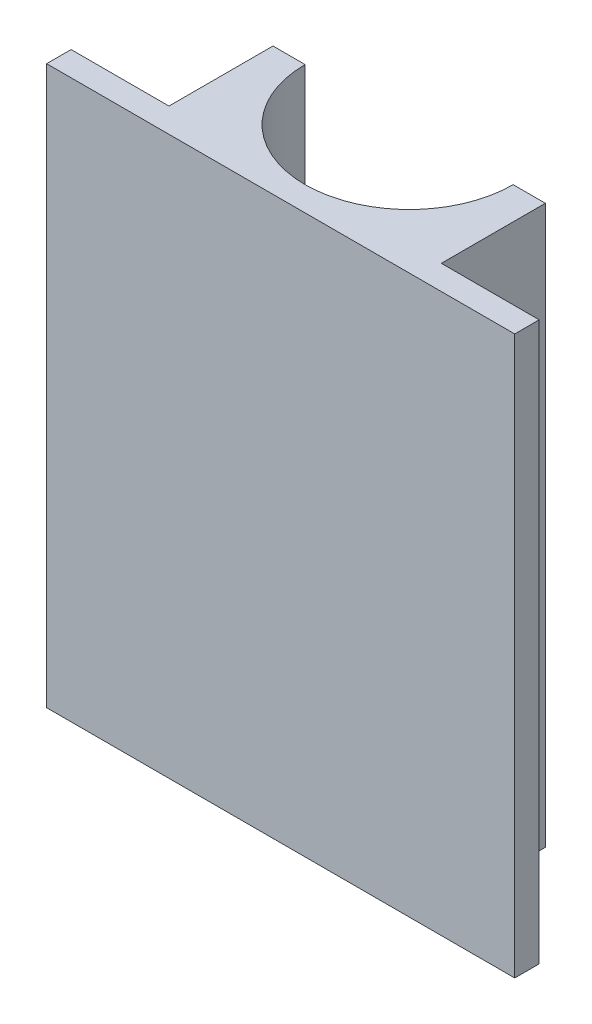
ISO-10303-21;
HEADER;
FILE_DESCRIPTION(('STEP AP214'),'2;1');
FILE_NAME('part.step','',(''),(''),'','','');
FILE_SCHEMA(('AUTOMOTIVE_DESIGN { 1 0 10303 214 1 1 1 1 }'));
ENDSEC;
DATA;
#1=APPLICATION_CONTEXT('core data for automotive mechanical design processes');
#2=APPLICATION_PROTOCOL_DEFINITION('international standard','automotive_design',2000,#1);
#3=PRODUCT_CONTEXT('',#1,'mechanical');
#4=PRODUCT('Part','Part','',(#3));
#5=PRODUCT_RELATED_PRODUCT_CATEGORY('part','',(#4));
#6=PRODUCT_DEFINITION_FORMATION('','',#4);
#7=PRODUCT_DEFINITION_CONTEXT('part definition',#1,'design');
#8=PRODUCT_DEFINITION('design','',#6,#7);
#9=PRODUCT_DEFINITION_SHAPE('','',#8);
#10=(LENGTH_UNIT() NAMED_UNIT(*) SI_UNIT(.MILLI.,.METRE.));
#11=(NAMED_UNIT(*) PLANE_ANGLE_UNIT() SI_UNIT($,.RADIAN.));
#12=(NAMED_UNIT(*) SI_UNIT($,.STERADIAN.) SOLID_ANGLE_UNIT());
#13=UNCERTAINTY_MEASURE_WITH_UNIT(LENGTH_MEASURE(1.E-05),#10,'distance_accuracy_value','');
#14=(GEOMETRIC_REPRESENTATION_CONTEXT(3) GLOBAL_UNCERTAINTY_ASSIGNED_CONTEXT((#13)) GLOBAL_UNIT_ASSIGNED_CONTEXT((#10,
#11,#12)) REPRESENTATION_CONTEXT('',''));
#15=CARTESIAN_POINT('',(0.,0.,0.));
#16=DIRECTION('',(0.,0.,1.));
#17=DIRECTION('',(1.,0.,0.));
#18=AXIS2_PLACEMENT_3D('',#15,#16,#17);
#19=CARTESIAN_POINT('',(6.525,72.39,-31.19817027));
#20=DIRECTION('',(0.,-1.,0.));
#21=DIRECTION('',(0.,0.,-1.));
#22=AXIS2_PLACEMENT_3D('',#19,#20,#21);
#23=CYLINDRICAL_SURFACE('',#22,13.5);
#24=CARTESIAN_POINT('',(6.525,51.39,-31.19817027));
#25=DIRECTION('',(0.,1.,0.));
#26=DIRECTION('',(0.,0.,1.));
#27=AXIS2_PLACEMENT_3D('',#24,#25,#26);
#28=CIRCLE('',#27,13.5);
#29=CARTESIAN_POINT('',(-6.975,51.39,-31.1981702709716));
#30=VERTEX_POINT('',#29);
#31=CARTESIAN_POINT('',(20.025,51.39,-31.1981702709716));
#32=VERTEX_POINT('',#31);
#33=EDGE_CURVE('E275',#30,#32,#28,.T.);
#34=ORIENTED_EDGE('',*,*,#33,.F.);
#35=DIRECTION('',(0.,-1.,0.));
#36=VECTOR('',#35,1.);
#37=CARTESIAN_POINT('',(-6.975,72.39,-31.1981702709716));
#38=LINE('',#37,#36);
#39=CARTESIAN_POINT('',(-6.975,72.39,-31.1981702709716));
#40=VERTEX_POINT('',#39);
#41=EDGE_CURVE('E11',#40,#30,#38,.T.);
#42=ORIENTED_EDGE('',*,*,#41,.F.);
#43=CARTESIAN_POINT('',(6.525,72.39,-31.19817027));
#44=DIRECTION('',(0.,1.,0.));
#45=DIRECTION('',(0.,0.,1.));
#46=AXIS2_PLACEMENT_3D('',#43,#44,#45);
#47=CIRCLE('',#46,13.5);
#48=CARTESIAN_POINT('',(20.025,72.39,-31.1981702709716));
#49=VERTEX_POINT('',#48);
#50=EDGE_CURVE('E172',#40,#49,#47,.T.);
#51=ORIENTED_EDGE('',*,*,#50,.T.);
#52=DIRECTION('',(0.,-1.,0.));
#53=VECTOR('',#52,1.);
#54=CARTESIAN_POINT('',(20.025,72.39,-31.1981702709716));
#55=LINE('',#54,#53);
#56=EDGE_CURVE('E137',#49,#32,#55,.T.);
#57=ORIENTED_EDGE('',*,*,#56,.T.);
#58=EDGE_LOOP('',(#34,#42,#51,#57));
#59=FACE_BOUND('',#58,.T.);
#60=ADVANCED_FACE('F32',(#59),#23,.F.);
#61=CARTESIAN_POINT('',(0.,72.39,-31.1981702709716));
#62=DIRECTION('',(0.,0.,1.));
#63=DIRECTION('',(1.,0.,0.));
#64=AXIS2_PLACEMENT_3D('',#61,#62,#63);
#65=PLANE('',#64);
#66=DIRECTION('',(-1.,0.,0.));
#67=VECTOR('',#66,1.);
#68=CARTESIAN_POINT('',(0.,0.,-31.1981702709716));
#69=LINE('',#68,#67);
#70=CARTESIAN_POINT('',(-6.675,0.,-31.1981702709716));
#71=VERTEX_POINT('',#70);
#72=CARTESIAN_POINT('',(-11.1466884,0.,-31.1981702709716));
#73=VERTEX_POINT('',#72);
#74=EDGE_CURVE('E144',#71,#73,#69,.T.);
#75=ORIENTED_EDGE('',*,*,#74,.T.);
#76=DIRECTION('',(0.,-1.,0.));
#77=VECTOR('',#76,1.);
#78=CARTESIAN_POINT('',(-11.1466884,72.39,-31.1981702709716));
#79=LINE('',#78,#77);
#80=CARTESIAN_POINT('',(-11.1466884,72.39,-31.1981702709716));
#81=VERTEX_POINT('',#80);
#82=EDGE_CURVE('E43',#81,#73,#79,.T.);
#83=ORIENTED_EDGE('',*,*,#82,.F.);
#84=DIRECTION('',(-1.,0.,0.));
#85=VECTOR('',#84,1.);
#86=CARTESIAN_POINT('',(0.,72.39,-31.1981702709716));
#87=LINE('',#86,#85);
#88=EDGE_CURVE('E254',#40,#81,#87,.T.);
#89=ORIENTED_EDGE('',*,*,#88,.F.);
#90=ORIENTED_EDGE('',*,*,#41,.T.);
#91=DIRECTION('',(1.,0.,0.));
#92=VECTOR('',#91,1.);
#93=CARTESIAN_POINT('',(-6.975,51.39,-31.1981702709716));
#94=LINE('',#93,#92);
#95=CARTESIAN_POINT('',(-6.675,51.39,-31.1981702709716));
#96=VERTEX_POINT('',#95);
#97=EDGE_CURVE('E283',#30,#96,#94,.T.);
#98=ORIENTED_EDGE('',*,*,#97,.T.);
#99=DIRECTION('',(0.,-1.,0.));
#100=VECTOR('',#99,1.);
#101=CARTESIAN_POINT('',(-6.675,51.39,-31.1981702709716));
#102=LINE('',#101,#100);
#103=EDGE_CURVE('E235',#96,#71,#102,.T.);
#104=ORIENTED_EDGE('',*,*,#103,.T.);
#105=EDGE_LOOP('',(#75,#83,#89,#90,#98,#104));
#106=FACE_BOUND('',#105,.T.);
#107=ADVANCED_FACE('F221',(#106),#65,.F.);
#108=CARTESIAN_POINT('',(-11.1466884,72.39,0.));
#109=DIRECTION('',(1.,0.,0.));
#110=DIRECTION('',(0.,0.,-1.));
#111=AXIS2_PLACEMENT_3D('',#108,#109,#110);
#112=PLANE('',#111);
#113=DIRECTION('',(0.,0.,1.));
#114=VECTOR('',#113,1.);
#115=CARTESIAN_POINT('',(-11.1466884,0.,0.));
#116=LINE('',#115,#114);
#117=CARTESIAN_POINT('',(-11.1466884,0.,-17.6981702709716));
#118=VERTEX_POINT('',#117);
#119=EDGE_CURVE('E146',#73,#118,#116,.T.);
#120=ORIENTED_EDGE('',*,*,#119,.T.);
#121=DIRECTION('',(0.,-1.,0.));
#122=VECTOR('',#121,1.);
#123=CARTESIAN_POINT('',(-11.1466884,72.39,-17.6981702709716));
#124=LINE('',#123,#122);
#125=CARTESIAN_POINT('',(-11.1466884,72.39,-17.6981702709716));
#126=VERTEX_POINT('',#125);
#127=EDGE_CURVE('E184',#126,#118,#124,.T.);
#128=ORIENTED_EDGE('',*,*,#127,.F.);
#129=DIRECTION('',(0.,0.,1.));
#130=VECTOR('',#129,1.);
#131=CARTESIAN_POINT('',(-11.1466884,72.39,0.));
#132=LINE('',#131,#130);
#133=EDGE_CURVE('E241',#81,#126,#132,.T.);
#134=ORIENTED_EDGE('',*,*,#133,.F.);
#135=ORIENTED_EDGE('',*,*,#82,.T.);
#136=EDGE_LOOP('',(#120,#128,#134,#135));
#137=FACE_BOUND('',#136,.T.);
#138=ADVANCED_FACE('F218',(#137),#112,.F.);
#139=CARTESIAN_POINT('',(0.,72.39,-17.6981702709716));
#140=DIRECTION('',(0.,0.,-1.));
#141=DIRECTION('',(-1.,0.,0.));
#142=AXIS2_PLACEMENT_3D('',#139,#140,#141);
#143=PLANE('',#142);
#144=DIRECTION('',(1.,0.,0.));
#145=VECTOR('',#144,1.);
#146=CARTESIAN_POINT('',(0.,0.,-17.6981702709716));
#147=LINE('',#146,#145);
#148=CARTESIAN_POINT('',(-23.8485284,0.,-17.6981702709716));
#149=VERTEX_POINT('',#148);
#150=EDGE_CURVE('E150',#149,#118,#147,.T.);
#151=ORIENTED_EDGE('',*,*,#150,.F.);
#152=DIRECTION('',(0.,-1.,0.));
#153=VECTOR('',#152,1.);
#154=CARTESIAN_POINT('',(-23.8485284,72.39,-17.6981702709716));
#155=LINE('',#154,#153);
#156=CARTESIAN_POINT('',(-23.8485284,72.39,-17.6981702709716));
#157=VERTEX_POINT('',#156);
#158=EDGE_CURVE('E182',#157,#149,#155,.T.);
#159=ORIENTED_EDGE('',*,*,#158,.F.);
#160=DIRECTION('',(1.,0.,0.));
#161=VECTOR('',#160,1.);
#162=CARTESIAN_POINT('',(0.,72.39,-17.6981702709716));
#163=LINE('',#162,#161);
#164=EDGE_CURVE('E249',#157,#126,#163,.T.);
#165=ORIENTED_EDGE('',*,*,#164,.T.);
#166=ORIENTED_EDGE('',*,*,#127,.T.);
#167=EDGE_LOOP('',(#151,#159,#165,#166));
#168=FACE_BOUND('',#167,.T.);
#169=ADVANCED_FACE('F214',(#168),#143,.T.);
#170=CARTESIAN_POINT('',(-23.8485284,72.39,0.));
#171=DIRECTION('',(1.,0.,0.));
#172=DIRECTION('',(0.,0.,-1.));
#173=AXIS2_PLACEMENT_3D('',#170,#171,#172);
#174=PLANE('',#173);
#175=DIRECTION('',(0.,0.,1.));
#176=VECTOR('',#175,1.);
#177=CARTESIAN_POINT('',(-23.8485284,0.,0.));
#178=LINE('',#177,#176);
#179=CARTESIAN_POINT('',(-23.8485284,0.,-14.5231702709716));
#180=VERTEX_POINT('',#179);
#181=EDGE_CURVE('E153',#149,#180,#178,.T.);
#182=ORIENTED_EDGE('',*,*,#181,.T.);
#183=DIRECTION('',(0.,-1.,0.));
#184=VECTOR('',#183,1.);
#185=CARTESIAN_POINT('',(-23.8485284,72.39,-14.5231702709716));
#186=LINE('',#185,#184);
#187=CARTESIAN_POINT('',(-23.8485284,72.39,-14.5231702709716));
#188=VERTEX_POINT('',#187);
#189=EDGE_CURVE('E179',#188,#180,#186,.T.);
#190=ORIENTED_EDGE('',*,*,#189,.F.);
#191=DIRECTION('',(0.,0.,1.));
#192=VECTOR('',#191,1.);
#193=CARTESIAN_POINT('',(-23.8485284,72.39,0.));
#194=LINE('',#193,#192);
#195=EDGE_CURVE('E250',#157,#188,#194,.T.);
#196=ORIENTED_EDGE('',*,*,#195,.F.);
#197=ORIENTED_EDGE('',*,*,#158,.T.);
#198=EDGE_LOOP('',(#182,#190,#196,#197));
#199=FACE_BOUND('',#198,.T.);
#200=ADVANCED_FACE('F210',(#199),#174,.F.);
#201=CARTESIAN_POINT('',(0.,72.39,-14.5231702709716));
#202=DIRECTION('',(0.,0.,-1.));
#203=DIRECTION('',(-1.,0.,0.));
#204=AXIS2_PLACEMENT_3D('',#201,#202,#203);
#205=PLANE('',#204);
#206=DIRECTION('',(1.,0.,0.));
#207=VECTOR('',#206,1.);
#208=CARTESIAN_POINT('',(0.,0.,-14.5231702709716));
#209=LINE('',#208,#207);
#210=CARTESIAN_POINT('',(36.9033116,0.,-14.5231702709716));
#211=VERTEX_POINT('',#210);
#212=EDGE_CURVE('E155',#180,#211,#209,.T.);
#213=ORIENTED_EDGE('',*,*,#212,.T.);
#214=DIRECTION('',(0.,-1.,0.));
#215=VECTOR('',#214,1.);
#216=CARTESIAN_POINT('',(36.9033116,72.39,-14.5231702709716));
#217=LINE('',#216,#215);
#218=CARTESIAN_POINT('',(36.9033116,72.39,-14.5231702709716));
#219=VERTEX_POINT('',#218);
#220=EDGE_CURVE('E177',#219,#211,#217,.T.);
#221=ORIENTED_EDGE('',*,*,#220,.F.);
#222=DIRECTION('',(1.,0.,0.));
#223=VECTOR('',#222,1.);
#224=CARTESIAN_POINT('',(0.,72.39,-14.5231702709716));
#225=LINE('',#224,#223);
#226=EDGE_CURVE('E252',#188,#219,#225,.T.);
#227=ORIENTED_EDGE('',*,*,#226,.F.);
#228=ORIENTED_EDGE('',*,*,#189,.T.);
#229=EDGE_LOOP('',(#213,#221,#227,#228));
#230=FACE_BOUND('',#229,.T.);
#231=ADVANCED_FACE('F206',(#230),#205,.F.);
#232=CARTESIAN_POINT('',(36.9033116,72.39,0.));
#233=DIRECTION('',(1.,0.,0.));
#234=DIRECTION('',(0.,0.,-1.));
#235=AXIS2_PLACEMENT_3D('',#232,#233,#234);
#236=PLANE('',#235);
#237=DIRECTION('',(0.,0.,1.));
#238=VECTOR('',#237,1.);
#239=CARTESIAN_POINT('',(36.9033116,0.,0.));
#240=LINE('',#239,#238);
#241=CARTESIAN_POINT('',(36.9033116,0.,-17.6981702709716));
#242=VERTEX_POINT('',#241);
#243=EDGE_CURVE('E158',#242,#211,#240,.T.);
#244=ORIENTED_EDGE('',*,*,#243,.F.);
#245=DIRECTION('',(0.,-1.,0.));
#246=VECTOR('',#245,1.);
#247=CARTESIAN_POINT('',(36.9033116,72.39,-17.6981702709716));
#248=LINE('',#247,#246);
#249=CARTESIAN_POINT('',(36.9033116,72.39,-17.6981702709716));
#250=VERTEX_POINT('',#249);
#251=EDGE_CURVE('E127',#250,#242,#248,.T.);
#252=ORIENTED_EDGE('',*,*,#251,.F.);
#253=DIRECTION('',(0.,0.,1.));
#254=VECTOR('',#253,1.);
#255=CARTESIAN_POINT('',(36.9033116,72.39,0.));
#256=LINE('',#255,#254);
#257=EDGE_CURVE('E133',#250,#219,#256,.T.);
#258=ORIENTED_EDGE('',*,*,#257,.T.);
#259=ORIENTED_EDGE('',*,*,#220,.T.);
#260=EDGE_LOOP('',(#244,#252,#258,#259));
#261=FACE_BOUND('',#260,.T.);
#262=ADVANCED_FACE('F203',(#261),#236,.T.);
#263=CARTESIAN_POINT('',(0.,72.39,-17.6981702709716));
#264=DIRECTION('',(0.,0.,-1.));
#265=DIRECTION('',(-1.,0.,0.));
#266=AXIS2_PLACEMENT_3D('',#263,#264,#265);
#267=PLANE('',#266);
#268=DIRECTION('',(1.,0.,0.));
#269=VECTOR('',#268,1.);
#270=CARTESIAN_POINT('',(0.,0.,-17.6981702709716));
#271=LINE('',#270,#269);
#272=CARTESIAN_POINT('',(24.2033116,0.,-17.6981702709716));
#273=VERTEX_POINT('',#272);
#274=EDGE_CURVE('E125',#273,#242,#271,.T.);
#275=ORIENTED_EDGE('',*,*,#274,.F.);
#276=CARTESIAN_POINT('',(24.2033116,72.39,-17.6981702709716));
#277=DIRECTION('',(0.,-1.,0.));
#278=VECTOR('',#277,1.);
#279=LINE('',#276,#278);
#280=CARTESIAN_POINT('',(24.2033116,72.39,-17.6981702709716));
#281=VERTEX_POINT('',#280);
#282=EDGE_CURVE('E83',#281,#273,#279,.T.);
#283=ORIENTED_EDGE('',*,*,#282,.F.);
#284=DIRECTION('',(1.,0.,0.));
#285=VECTOR('',#284,1.);
#286=CARTESIAN_POINT('',(0.,72.39,-17.6981702709716));
#287=LINE('',#286,#285);
#288=EDGE_CURVE('E123',#281,#250,#287,.T.);
#289=ORIENTED_EDGE('',*,*,#288,.T.);
#290=ORIENTED_EDGE('',*,*,#251,.T.);
#291=EDGE_LOOP('',(#275,#283,#289,#290));
#292=FACE_BOUND('',#291,.T.);
#293=ADVANCED_FACE('F122',(#292),#267,.T.);
#294=CARTESIAN_POINT('',(24.2033116,72.39,0.));
#295=DIRECTION('',(1.,0.,0.));
#296=DIRECTION('',(0.,0.,-1.));
#297=AXIS2_PLACEMENT_3D('',#294,#295,#296);
#298=PLANE('',#297);
#299=DIRECTION('',(0.,0.,1.));
#300=VECTOR('',#299,1.);
#301=CARTESIAN_POINT('',(24.2033116,0.,0.));
#302=LINE('',#301,#300);
#303=CARTESIAN_POINT('',(24.2033116,0.,-31.1981702709716));
#304=VERTEX_POINT('',#303);
#305=EDGE_CURVE('E164',#304,#273,#302,.T.);
#306=ORIENTED_EDGE('',*,*,#305,.F.);
#307=DIRECTION('',(0.,-1.,0.));
#308=VECTOR('',#307,1.);
#309=CARTESIAN_POINT('',(24.2033116,72.39,-31.1981702709716));
#310=LINE('',#309,#308);
#311=CARTESIAN_POINT('',(24.2033116,72.39,-31.1981702709716));
#312=VERTEX_POINT('',#311);
#313=EDGE_CURVE('E90',#312,#304,#310,.T.);
#314=ORIENTED_EDGE('',*,*,#313,.F.);
#315=DIRECTION('',(0.,0.,1.));
#316=VECTOR('',#315,1.);
#317=CARTESIAN_POINT('',(24.2033116,72.39,0.));
#318=LINE('',#317,#316);
#319=EDGE_CURVE('E131',#312,#281,#318,.T.);
#320=ORIENTED_EDGE('',*,*,#319,.T.);
#321=ORIENTED_EDGE('',*,*,#282,.T.);
#322=EDGE_LOOP('',(#306,#314,#320,#321));
#323=FACE_BOUND('',#322,.T.);
#324=ADVANCED_FACE('F135',(#323),#298,.T.);
#325=CARTESIAN_POINT('',(0.,72.39,-31.1981702709716));
#326=DIRECTION('',(0.,0.,1.));
#327=DIRECTION('',(1.,0.,0.));
#328=AXIS2_PLACEMENT_3D('',#325,#326,#327);
#329=PLANE('',#328);
#330=DIRECTION('',(-1.,0.,0.));
#331=VECTOR('',#330,1.);
#332=CARTESIAN_POINT('',(0.,0.,-31.1981702709716));
#333=LINE('',#332,#331);
#334=CARTESIAN_POINT('',(19.725,0.,-31.1981702709716));
#335=VERTEX_POINT('',#334);
#336=EDGE_CURVE('E168',#304,#335,#333,.T.);
#337=ORIENTED_EDGE('',*,*,#336,.T.);
#338=DIRECTION('',(0.,-1.,0.));
#339=VECTOR('',#338,1.);
#340=CARTESIAN_POINT('',(19.725,51.39,-31.1981702709716));
#341=LINE('',#340,#339);
#342=CARTESIAN_POINT('',(19.725,51.39,-31.1981702709716));
#343=VERTEX_POINT('',#342);
#344=EDGE_CURVE('E147',#343,#335,#341,.T.);
#345=ORIENTED_EDGE('',*,*,#344,.F.);
#346=DIRECTION('',(-1.,0.,0.));
#347=VECTOR('',#346,1.);
#348=CARTESIAN_POINT('',(20.025,51.39,-31.1981702709716));
#349=LINE('',#348,#347);
#350=EDGE_CURVE('E293',#32,#343,#349,.T.);
#351=ORIENTED_EDGE('',*,*,#350,.F.);
#352=ORIENTED_EDGE('',*,*,#56,.F.);
#353=DIRECTION('',(-1.,0.,0.));
#354=VECTOR('',#353,1.);
#355=CARTESIAN_POINT('',(0.,72.39,-31.1981702709716));
#356=LINE('',#355,#354);
#357=EDGE_CURVE('E52',#312,#49,#356,.T.);
#358=ORIENTED_EDGE('',*,*,#357,.F.);
#359=ORIENTED_EDGE('',*,*,#313,.T.);
#360=EDGE_LOOP('',(#337,#345,#351,#352,#358,#359));
#361=FACE_BOUND('',#360,.T.);
#362=ADVANCED_FACE('F198',(#361),#329,.F.);
#363=CARTESIAN_POINT('',(0.,72.39,0.));
#364=DIRECTION('',(0.,1.,0.));
#365=DIRECTION('',(0.,0.,1.));
#366=AXIS2_PLACEMENT_3D('',#363,#364,#365);
#367=PLANE('',#366);
#368=ORIENTED_EDGE('',*,*,#50,.F.);
#369=ORIENTED_EDGE('',*,*,#88,.T.);
#370=ORIENTED_EDGE('',*,*,#133,.T.);
#371=ORIENTED_EDGE('',*,*,#164,.F.);
#372=ORIENTED_EDGE('',*,*,#195,.T.);
#373=ORIENTED_EDGE('',*,*,#226,.T.);
#374=ORIENTED_EDGE('',*,*,#257,.F.);
#375=ORIENTED_EDGE('',*,*,#288,.F.);
#376=ORIENTED_EDGE('',*,*,#319,.F.);
#377=ORIENTED_EDGE('',*,*,#357,.T.);
#378=EDGE_LOOP('',(#368,#369,#370,#371,#372,#373,#374,#375,#376,#377));
#379=FACE_BOUND('',#378,.T.);
#380=ADVANCED_FACE('F130',(#379),#367,.T.);
#381=CARTESIAN_POINT('',(0.,0.,0.));
#382=DIRECTION('',(0.,1.,0.));
#383=DIRECTION('',(0.,0.,1.));
#384=AXIS2_PLACEMENT_3D('',#381,#382,#383);
#385=PLANE('',#384);
#386=ORIENTED_EDGE('',*,*,#74,.F.);
#387=CARTESIAN_POINT('',(6.525,0.,-31.19817027));
#388=DIRECTION('',(0.,1.,0.));
#389=DIRECTION('',(0.,0.,1.));
#390=AXIS2_PLACEMENT_3D('',#387,#388,#389);
#391=CIRCLE('',#390,13.2);
#392=EDGE_CURVE('E263',#71,#335,#391,.T.);
#393=ORIENTED_EDGE('',*,*,#392,.T.);
#394=ORIENTED_EDGE('',*,*,#336,.F.);
#395=ORIENTED_EDGE('',*,*,#305,.T.);
#396=ORIENTED_EDGE('',*,*,#274,.T.);
#397=ORIENTED_EDGE('',*,*,#243,.T.);
#398=ORIENTED_EDGE('',*,*,#212,.F.);
#399=ORIENTED_EDGE('',*,*,#181,.F.);
#400=ORIENTED_EDGE('',*,*,#150,.T.);
#401=ORIENTED_EDGE('',*,*,#119,.F.);
#402=EDGE_LOOP('',(#386,#393,#394,#395,#396,#397,#398,#399,#400,#401));
#403=FACE_BOUND('',#402,.T.);
#404=ADVANCED_FACE('F242',(#403),#385,.F.);
#405=CARTESIAN_POINT('',(6.525,51.39,-31.19817027));
#406=DIRECTION('',(0.,-1.,0.));
#407=DIRECTION('',(0.,0.,-1.));
#408=AXIS2_PLACEMENT_3D('',#405,#406,#407);
#409=CYLINDRICAL_SURFACE('',#408,13.2);
#410=ORIENTED_EDGE('',*,*,#392,.F.);
#411=ORIENTED_EDGE('',*,*,#103,.F.);
#412=CARTESIAN_POINT('',(6.525,51.39,-31.19817027));
#413=DIRECTION('',(0.,1.,0.));
#414=DIRECTION('',(0.,0.,1.));
#415=AXIS2_PLACEMENT_3D('',#412,#413,#414);
#416=CIRCLE('',#415,13.2);
#417=EDGE_CURVE('E273',#96,#343,#416,.T.);
#418=ORIENTED_EDGE('',*,*,#417,.T.);
#419=ORIENTED_EDGE('',*,*,#344,.T.);
#420=EDGE_LOOP('',(#410,#411,#418,#419));
#421=FACE_BOUND('',#420,.T.);
#422=ADVANCED_FACE('F271',(#421),#409,.F.);
#423=CARTESIAN_POINT('',(6.525,51.39,-31.19817027));
#424=DIRECTION('',(0.,1.,0.));
#425=DIRECTION('',(0.,0.,1.));
#426=AXIS2_PLACEMENT_3D('',#423,#424,#425);
#427=PLANE('',#426);
#428=ORIENTED_EDGE('',*,*,#97,.F.);
#429=ORIENTED_EDGE('',*,*,#33,.T.);
#430=ORIENTED_EDGE('',*,*,#350,.T.);
#431=ORIENTED_EDGE('',*,*,#417,.F.);
#432=EDGE_LOOP('',(#428,#429,#430,#431));
#433=FACE_BOUND('',#432,.T.);
#434=ADVANCED_FACE('F292',(#433),#427,.T.);
#435=CLOSED_SHELL('',(#60,#107,#138,#169,#200,#231,#262,#293,#324,#362,#380,#404,#422,#434));
#436=MANIFOLD_SOLID_BREP('B2',#435);
#437=ADVANCED_BREP_SHAPE_REPRESENTATION('',(#18,#436),#14);
#438=SHAPE_DEFINITION_REPRESENTATION(#9,#437);
ENDSEC;
END-ISO-10303-21;
